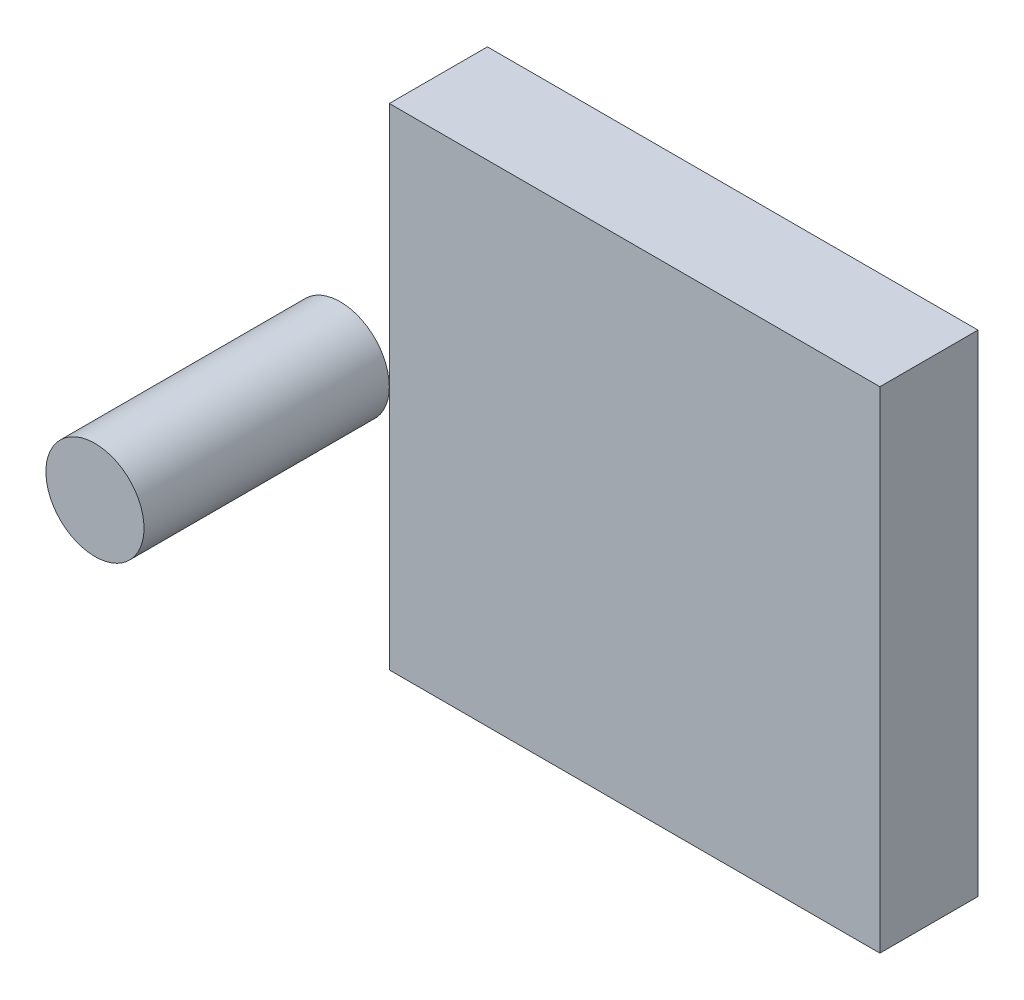
ISO-10303-21;
HEADER;
FILE_DESCRIPTION(('STEP AP214'),'2;1');
FILE_NAME('part.step','',(''),(''),'','','');
FILE_SCHEMA(('AUTOMOTIVE_DESIGN { 1 0 10303 214 1 1 1 1 }'));
ENDSEC;
DATA;
#1=APPLICATION_CONTEXT('core data for automotive mechanical design processes');
#2=APPLICATION_PROTOCOL_DEFINITION('international standard','automotive_design',2000,#1);
#3=PRODUCT_CONTEXT('',#1,'mechanical');
#4=PRODUCT('Part','Part','',(#3));
#5=PRODUCT_RELATED_PRODUCT_CATEGORY('part','',(#4));
#6=PRODUCT_DEFINITION_FORMATION('','',#4);
#7=PRODUCT_DEFINITION_CONTEXT('part definition',#1,'design');
#8=PRODUCT_DEFINITION('design','',#6,#7);
#9=PRODUCT_DEFINITION_SHAPE('','',#8);
#10=(LENGTH_UNIT() NAMED_UNIT(*) SI_UNIT(.MILLI.,.METRE.));
#11=(NAMED_UNIT(*) PLANE_ANGLE_UNIT() SI_UNIT($,.RADIAN.));
#12=(NAMED_UNIT(*) SI_UNIT($,.STERADIAN.) SOLID_ANGLE_UNIT());
#13=UNCERTAINTY_MEASURE_WITH_UNIT(LENGTH_MEASURE(1.E-05),#10,'distance_accuracy_value','');
#14=(GEOMETRIC_REPRESENTATION_CONTEXT(3) GLOBAL_UNCERTAINTY_ASSIGNED_CONTEXT((#13)) GLOBAL_UNIT_ASSIGNED_CONTEXT((#10,
#11,#12)) REPRESENTATION_CONTEXT('',''));
#15=CARTESIAN_POINT('',(0.,0.,0.));
#16=DIRECTION('',(0.,0.,1.));
#17=DIRECTION('',(1.,0.,0.));
#18=AXIS2_PLACEMENT_3D('',#15,#16,#17);
#19=CARTESIAN_POINT('',(-60.,0.,70.));
#20=DIRECTION('',(0.,0.,-1.));
#21=DIRECTION('',(-1.,0.,0.));
#22=AXIS2_PLACEMENT_3D('',#19,#20,#21);
#23=CYLINDRICAL_SURFACE('',#22,9.99999999999999);
#24=CARTESIAN_POINT('',(-60.,0.,70.));
#25=DIRECTION('',(0.,0.,1.));
#26=DIRECTION('',(1.,0.,0.));
#27=AXIS2_PLACEMENT_3D('',#24,#25,#26);
#28=CIRCLE('',#27,9.99999999999999);
#29=CARTESIAN_POINT('',(-50.,0.,70.));
#30=VERTEX_POINT('',#29);
#31=EDGE_CURVE('E11',#30,#30,#28,.T.);
#32=ORIENTED_EDGE('',*,*,#31,.F.);
#33=EDGE_LOOP('',(#32));
#34=FACE_BOUND('',#33,.T.);
#35=CARTESIAN_POINT('',(-60.,0.,20.));
#36=DIRECTION('',(0.,0.,1.));
#37=DIRECTION('',(1.,0.,0.));
#38=AXIS2_PLACEMENT_3D('',#35,#36,#37);
#39=CIRCLE('',#38,9.99999999999999);
#40=CARTESIAN_POINT('',(-50.,0.,20.));
#41=VERTEX_POINT('',#40);
#42=EDGE_CURVE('E52',#41,#41,#39,.T.);
#43=ORIENTED_EDGE('',*,*,#42,.T.);
#44=EDGE_LOOP('',(#43));
#45=FACE_BOUND('',#44,.T.);
#46=ADVANCED_FACE('F49',(#34,#45),#23,.T.);
#47=CARTESIAN_POINT('',(-60.,0.,70.));
#48=DIRECTION('',(0.,0.,1.));
#49=DIRECTION('',(1.,0.,0.));
#50=AXIS2_PLACEMENT_3D('',#47,#48,#49);
#51=PLANE('',#50);
#52=ORIENTED_EDGE('',*,*,#31,.T.);
#53=EDGE_LOOP('',(#52));
#54=FACE_BOUND('',#53,.T.);
#55=ADVANCED_FACE('F64',(#54),#51,.T.);
#56=CARTESIAN_POINT('',(-60.,0.,20.));
#57=DIRECTION('',(0.,0.,1.));
#58=DIRECTION('',(1.,0.,0.));
#59=AXIS2_PLACEMENT_3D('',#56,#57,#58);
#60=PLANE('',#59);
#61=ORIENTED_EDGE('',*,*,#42,.F.);
#62=EDGE_LOOP('',(#61));
#63=FACE_BOUND('',#62,.T.);
#64=ADVANCED_FACE('F62',(#63),#60,.F.);
#65=CLOSED_SHELL('',(#46,#55,#64));
#66=MANIFOLD_SOLID_BREP('B2',#65);
#67=CARTESIAN_POINT('',(50.,-50.,20.));
#68=DIRECTION('',(-1.,0.,0.));
#69=DIRECTION('',(0.,0.,1.));
#70=AXIS2_PLACEMENT_3D('',#67,#68,#69);
#71=PLANE('',#70);
#72=DIRECTION('',(0.,1.,0.));
#73=VECTOR('',#72,1.);
#74=CARTESIAN_POINT('',(50.,-50.,0.));
#75=LINE('',#74,#73);
#76=CARTESIAN_POINT('',(50.,-50.,0.));
#77=VERTEX_POINT('',#76);
#78=CARTESIAN_POINT('',(50.,50.,0.));
#79=VERTEX_POINT('',#78);
#80=EDGE_CURVE('E157',#77,#79,#75,.T.);
#81=ORIENTED_EDGE('',*,*,#80,.T.);
#82=DIRECTION('',(0.,0.,-1.));
#83=VECTOR('',#82,1.);
#84=CARTESIAN_POINT('',(50.,50.,20.));
#85=LINE('',#84,#83);
#86=CARTESIAN_POINT('',(50.,50.,20.));
#87=VERTEX_POINT('',#86);
#88=EDGE_CURVE('E47',#87,#79,#85,.T.);
#89=ORIENTED_EDGE('',*,*,#88,.F.);
#90=DIRECTION('',(0.,1.,0.));
#91=VECTOR('',#90,1.);
#92=CARTESIAN_POINT('',(50.,-50.,20.));
#93=LINE('',#92,#91);
#94=CARTESIAN_POINT('',(50.,-50.,20.));
#95=VERTEX_POINT('',#94);
#96=EDGE_CURVE('E143',#95,#87,#93,.T.);
#97=ORIENTED_EDGE('',*,*,#96,.F.);
#98=DIRECTION('',(0.,0.,-1.));
#99=VECTOR('',#98,1.);
#100=CARTESIAN_POINT('',(50.,-50.,20.));
#101=LINE('',#100,#99);
#102=EDGE_CURVE('E153',#95,#77,#101,.T.);
#103=ORIENTED_EDGE('',*,*,#102,.T.);
#104=EDGE_LOOP('',(#81,#89,#97,#103));
#105=FACE_BOUND('',#104,.T.);
#106=ADVANCED_FACE('F90',(#105),#71,.F.);
#107=CARTESIAN_POINT('',(-50.,50.,20.));
#108=DIRECTION('',(0.,-1.,0.));
#109=DIRECTION('',(0.,0.,-1.));
#110=AXIS2_PLACEMENT_3D('',#107,#108,#109);
#111=PLANE('',#110);
#112=DIRECTION('',(-1.,0.,0.));
#113=VECTOR('',#112,1.);
#114=CARTESIAN_POINT('',(-50.,50.,0.));
#115=LINE('',#114,#113);
#116=CARTESIAN_POINT('',(-50.,50.,0.));
#117=VERTEX_POINT('',#116);
#118=EDGE_CURVE('E148',#79,#117,#115,.T.);
#119=ORIENTED_EDGE('',*,*,#118,.T.);
#120=DIRECTION('',(0.,0.,-1.));
#121=VECTOR('',#120,1.);
#122=CARTESIAN_POINT('',(-50.,50.,20.));
#123=LINE('',#122,#121);
#124=CARTESIAN_POINT('',(-50.,50.,20.));
#125=VERTEX_POINT('',#124);
#126=EDGE_CURVE('E97',#125,#117,#123,.T.);
#127=ORIENTED_EDGE('',*,*,#126,.F.);
#128=DIRECTION('',(-1.,0.,0.));
#129=VECTOR('',#128,1.);
#130=CARTESIAN_POINT('',(-50.,50.,20.));
#131=LINE('',#130,#129);
#132=EDGE_CURVE('E139',#87,#125,#131,.T.);
#133=ORIENTED_EDGE('',*,*,#132,.F.);
#134=ORIENTED_EDGE('',*,*,#88,.T.);
#135=EDGE_LOOP('',(#119,#127,#133,#134));
#136=FACE_BOUND('',#135,.T.);
#137=ADVANCED_FACE('F147',(#136),#111,.F.);
#138=CARTESIAN_POINT('',(-50.,-50.,20.));
#139=DIRECTION('',(1.,0.,0.));
#140=DIRECTION('',(0.,0.,-1.));
#141=AXIS2_PLACEMENT_3D('',#138,#139,#140);
#142=PLANE('',#141);
#143=DIRECTION('',(0.,-1.,0.));
#144=VECTOR('',#143,1.);
#145=CARTESIAN_POINT('',(-50.,-50.,0.));
#146=LINE('',#145,#144);
#147=CARTESIAN_POINT('',(-50.,-50.,0.));
#148=VERTEX_POINT('',#147);
#149=EDGE_CURVE('E161',#117,#148,#146,.T.);
#150=ORIENTED_EDGE('',*,*,#149,.T.);
#151=DIRECTION('',(0.,0.,-1.));
#152=VECTOR('',#151,1.);
#153=CARTESIAN_POINT('',(-50.,-50.,20.));
#154=LINE('',#153,#152);
#155=CARTESIAN_POINT('',(-50.,-50.,20.));
#156=VERTEX_POINT('',#155);
#157=EDGE_CURVE('E150',#156,#148,#154,.T.);
#158=ORIENTED_EDGE('',*,*,#157,.F.);
#159=DIRECTION('',(0.,-1.,0.));
#160=VECTOR('',#159,1.);
#161=CARTESIAN_POINT('',(-50.,-50.,20.));
#162=LINE('',#161,#160);
#163=CARTESIAN_POINT('',(-50.,0.,20.));
#164=VERTEX_POINT('',#163);
#165=EDGE_CURVE('E104',#164,#156,#162,.T.);
#166=ORIENTED_EDGE('',*,*,#165,.F.);
#167=EDGE_CURVE('E141',#125,#164,#162,.T.);
#168=ORIENTED_EDGE('',*,*,#167,.F.);
#169=ORIENTED_EDGE('',*,*,#126,.T.);
#170=EDGE_LOOP('',(#150,#158,#166,#168,#169));
#171=FACE_BOUND('',#170,.T.);
#172=ADVANCED_FACE('F151',(#171),#142,.F.);
#173=CARTESIAN_POINT('',(-50.,-50.,20.));
#174=DIRECTION('',(0.,1.,0.));
#175=DIRECTION('',(0.,0.,1.));
#176=AXIS2_PLACEMENT_3D('',#173,#174,#175);
#177=PLANE('',#176);
#178=DIRECTION('',(1.,0.,0.));
#179=VECTOR('',#178,1.);
#180=CARTESIAN_POINT('',(-50.,-50.,0.));
#181=LINE('',#180,#179);
#182=EDGE_CURVE('E132',#148,#77,#181,.T.);
#183=ORIENTED_EDGE('',*,*,#182,.T.);
#184=ORIENTED_EDGE('',*,*,#102,.F.);
#185=DIRECTION('',(1.,0.,0.));
#186=VECTOR('',#185,1.);
#187=CARTESIAN_POINT('',(-50.,-50.,20.));
#188=LINE('',#187,#186);
#189=EDGE_CURVE('E112',#156,#95,#188,.T.);
#190=ORIENTED_EDGE('',*,*,#189,.F.);
#191=ORIENTED_EDGE('',*,*,#157,.T.);
#192=EDGE_LOOP('',(#183,#184,#190,#191));
#193=FACE_BOUND('',#192,.T.);
#194=ADVANCED_FACE('F165',(#193),#177,.F.);
#195=CARTESIAN_POINT('',(0.,0.,20.));
#196=DIRECTION('',(0.,0.,-1.));
#197=DIRECTION('',(-1.,0.,0.));
#198=AXIS2_PLACEMENT_3D('',#195,#196,#197);
#199=PLANE('',#198);
#200=ORIENTED_EDGE('',*,*,#96,.T.);
#201=ORIENTED_EDGE('',*,*,#132,.T.);
#202=ORIENTED_EDGE('',*,*,#167,.T.);
#203=ORIENTED_EDGE('',*,*,#165,.T.);
#204=ORIENTED_EDGE('',*,*,#189,.T.);
#205=EDGE_LOOP('',(#200,#201,#202,#203,#204));
#206=FACE_BOUND('',#205,.T.);
#207=ADVANCED_FACE('F140',(#206),#199,.F.);
#208=CARTESIAN_POINT('',(0.,0.,0.));
#209=DIRECTION('',(0.,0.,-1.));
#210=DIRECTION('',(-1.,0.,0.));
#211=AXIS2_PLACEMENT_3D('',#208,#209,#210);
#212=PLANE('',#211);
#213=ORIENTED_EDGE('',*,*,#80,.F.);
#214=ORIENTED_EDGE('',*,*,#182,.F.);
#215=ORIENTED_EDGE('',*,*,#149,.F.);
#216=ORIENTED_EDGE('',*,*,#118,.F.);
#217=EDGE_LOOP('',(#213,#214,#215,#216));
#218=FACE_BOUND('',#217,.T.);
#219=ADVANCED_FACE('F168',(#218),#212,.T.);
#220=CLOSED_SHELL('',(#106,#137,#172,#194,#207,#219));
#221=MANIFOLD_SOLID_BREP('B6',#220);
#222=ADVANCED_BREP_SHAPE_REPRESENTATION('',(#18,#66,#221),#14);
#223=SHAPE_DEFINITION_REPRESENTATION(#9,#222);
ENDSEC;
END-ISO-10303-21;
